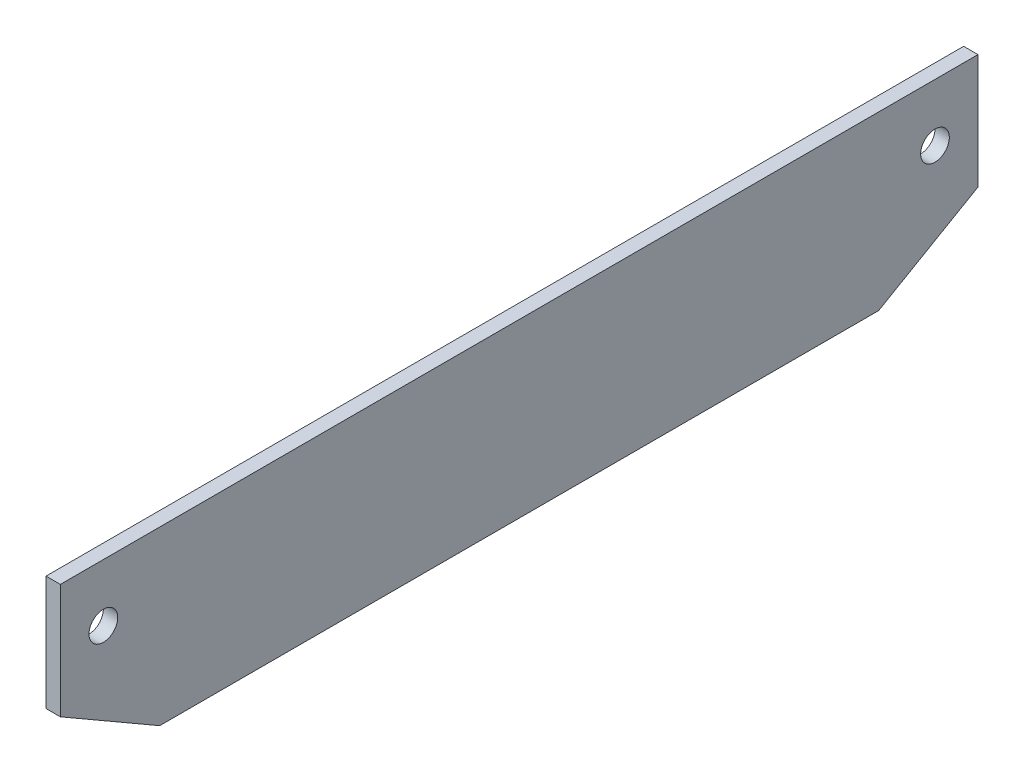
ISO-10303-21;
HEADER;
FILE_DESCRIPTION(('STEP AP214'),'2;1');
FILE_NAME('part.step','',(''),(''),'','','');
FILE_SCHEMA(('AUTOMOTIVE_DESIGN { 1 0 10303 214 1 1 1 1 }'));
ENDSEC;
DATA;
#1=APPLICATION_CONTEXT('core data for automotive mechanical design processes');
#2=APPLICATION_PROTOCOL_DEFINITION('international standard','automotive_design',2000,#1);
#3=PRODUCT_CONTEXT('',#1,'mechanical');
#4=PRODUCT('Part','Part','',(#3));
#5=PRODUCT_RELATED_PRODUCT_CATEGORY('part','',(#4));
#6=PRODUCT_DEFINITION_FORMATION('','',#4);
#7=PRODUCT_DEFINITION_CONTEXT('part definition',#1,'design');
#8=PRODUCT_DEFINITION('design','',#6,#7);
#9=PRODUCT_DEFINITION_SHAPE('','',#8);
#10=(LENGTH_UNIT() NAMED_UNIT(*) SI_UNIT(.MILLI.,.METRE.));
#11=(NAMED_UNIT(*) PLANE_ANGLE_UNIT() SI_UNIT($,.RADIAN.));
#12=(NAMED_UNIT(*) SI_UNIT($,.STERADIAN.) SOLID_ANGLE_UNIT());
#13=UNCERTAINTY_MEASURE_WITH_UNIT(LENGTH_MEASURE(1.E-05),#10,'distance_accuracy_value','');
#14=(GEOMETRIC_REPRESENTATION_CONTEXT(3) GLOBAL_UNCERTAINTY_ASSIGNED_CONTEXT((#13)) GLOBAL_UNIT_ASSIGNED_CONTEXT((#10,
#11,#12)) REPRESENTATION_CONTEXT('',''));
#15=CARTESIAN_POINT('',(0.,0.,0.));
#16=DIRECTION('',(0.,0.,1.));
#17=DIRECTION('',(1.,0.,0.));
#18=AXIS2_PLACEMENT_3D('',#15,#16,#17);
#19=CARTESIAN_POINT('',(3.175,0.,0.));
#20=DIRECTION('',(-1.,0.,0.));
#21=DIRECTION('',(0.,0.,1.));
#22=AXIS2_PLACEMENT_3D('',#19,#20,#21);
#23=PLANE('',#22);
#24=DIRECTION('',(0.,1.,0.));
#25=VECTOR('',#24,1.);
#26=CARTESIAN_POINT('',(3.175,-12.7,-101.6));
#27=LINE('',#26,#25);
#28=CARTESIAN_POINT('',(3.175,-12.7,-101.6));
#29=VERTEX_POINT('',#28);
#30=CARTESIAN_POINT('',(3.175,12.7,-101.6));
#31=VERTEX_POINT('',#30);
#32=EDGE_CURVE('E128',#29,#31,#27,.T.);
#33=ORIENTED_EDGE('',*,*,#32,.T.);
#34=DIRECTION('',(0.,0.,1.));
#35=VECTOR('',#34,1.);
#36=CARTESIAN_POINT('',(3.175,12.7,101.6));
#37=LINE('',#36,#35);
#38=CARTESIAN_POINT('',(3.175,12.7,101.6));
#39=VERTEX_POINT('',#38);
#40=EDGE_CURVE('E86',#31,#39,#37,.T.);
#41=ORIENTED_EDGE('',*,*,#40,.T.);
#42=DIRECTION('',(0.,-1.,0.));
#43=VECTOR('',#42,1.);
#44=CARTESIAN_POINT('',(3.175,-12.7,101.6));
#45=LINE('',#44,#43);
#46=CARTESIAN_POINT('',(3.175,-12.7,101.6));
#47=VERTEX_POINT('',#46);
#48=EDGE_CURVE('E99',#39,#47,#45,.T.);
#49=ORIENTED_EDGE('',*,*,#48,.T.);
#50=DIRECTION('',(0.,-0.499999999999995,-0.866025403784442));
#51=VECTOR('',#50,1.);
#52=CARTESIAN_POINT('',(3.175,-12.7,101.6));
#53=LINE('',#52,#51);
#54=CARTESIAN_POINT('',(3.175,-25.4,79.6029547438749));
#55=VERTEX_POINT('',#54);
#56=EDGE_CURVE('E93',#47,#55,#53,.T.);
#57=ORIENTED_EDGE('',*,*,#56,.T.);
#58=DIRECTION('',(0.,0.,-1.));
#59=VECTOR('',#58,1.);
#60=CARTESIAN_POINT('',(3.175,-25.4,-79.6029547438749));
#61=LINE('',#60,#59);
#62=CARTESIAN_POINT('',(3.175,-25.4,-79.6029547438749));
#63=VERTEX_POINT('',#62);
#64=EDGE_CURVE('E97',#55,#63,#61,.T.);
#65=ORIENTED_EDGE('',*,*,#64,.T.);
#66=DIRECTION('',(0.,0.499999999999994,-0.866025403784442));
#67=VECTOR('',#66,1.);
#68=CARTESIAN_POINT('',(3.175,-12.7,-101.6));
#69=LINE('',#68,#67);
#70=EDGE_CURVE('E49',#63,#29,#69,.T.);
#71=ORIENTED_EDGE('',*,*,#70,.T.);
#72=EDGE_LOOP('',(#33,#41,#49,#57,#65,#71));
#73=FACE_BOUND('',#72,.T.);
#74=CARTESIAN_POINT('',(3.175,0.,92.075));
#75=DIRECTION('',(1.,0.,0.));
#76=DIRECTION('',(0.,0.,-1.));
#77=AXIS2_PLACEMENT_3D('',#74,#75,#76);
#78=CIRCLE('',#77,3.175);
#79=CARTESIAN_POINT('',(3.175,0.,88.9));
#80=VERTEX_POINT('',#79);
#81=EDGE_CURVE('E121',#80,#80,#78,.T.);
#82=ORIENTED_EDGE('',*,*,#81,.F.);
#83=EDGE_LOOP('',(#82));
#84=FACE_BOUND('',#83,.T.);
#85=CARTESIAN_POINT('',(3.175,0.,-92.075));
#86=DIRECTION('',(1.,0.,0.));
#87=DIRECTION('',(0.,0.,-1.));
#88=AXIS2_PLACEMENT_3D('',#85,#86,#87);
#89=CIRCLE('',#88,3.175);
#90=CARTESIAN_POINT('',(3.175,0.,-95.25));
#91=VERTEX_POINT('',#90);
#92=EDGE_CURVE('E169',#91,#91,#89,.T.);
#93=ORIENTED_EDGE('',*,*,#92,.F.);
#94=EDGE_LOOP('',(#93));
#95=FACE_BOUND('',#94,.T.);
#96=ADVANCED_FACE('F32',(#73,#84,#95),#23,.F.);
#97=CARTESIAN_POINT('',(0.,0.,0.));
#98=DIRECTION('',(-1.,0.,0.));
#99=DIRECTION('',(0.,0.,1.));
#100=AXIS2_PLACEMENT_3D('',#97,#98,#99);
#101=PLANE('',#100);
#102=CARTESIAN_POINT('',(0.,0.,92.075));
#103=DIRECTION('',(1.,0.,0.));
#104=DIRECTION('',(0.,0.,-1.));
#105=AXIS2_PLACEMENT_3D('',#102,#103,#104);
#106=CIRCLE('',#105,3.175);
#107=CARTESIAN_POINT('',(0.,0.,88.9));
#108=VERTEX_POINT('',#107);
#109=EDGE_CURVE('E174',#108,#108,#106,.T.);
#110=ORIENTED_EDGE('',*,*,#109,.T.);
#111=EDGE_LOOP('',(#110));
#112=FACE_BOUND('',#111,.T.);
#113=DIRECTION('',(0.,1.,0.));
#114=VECTOR('',#113,1.);
#115=CARTESIAN_POINT('',(0.,-12.7,-101.6));
#116=LINE('',#115,#114);
#117=CARTESIAN_POINT('',(0.,-12.7,-101.6));
#118=VERTEX_POINT('',#117);
#119=CARTESIAN_POINT('',(0.,12.7,-101.6));
#120=VERTEX_POINT('',#119);
#121=EDGE_CURVE('E117',#118,#120,#116,.T.);
#122=ORIENTED_EDGE('',*,*,#121,.F.);
#123=DIRECTION('',(0.,0.499999999999994,-0.866025403784442));
#124=VECTOR('',#123,1.);
#125=CARTESIAN_POINT('',(0.,-12.7,-101.6));
#126=LINE('',#125,#124);
#127=CARTESIAN_POINT('',(0.,-25.4,-79.6029547438749));
#128=VERTEX_POINT('',#127);
#129=EDGE_CURVE('E78',#128,#118,#126,.T.);
#130=ORIENTED_EDGE('',*,*,#129,.F.);
#131=DIRECTION('',(0.,0.,-1.));
#132=VECTOR('',#131,1.);
#133=CARTESIAN_POINT('',(0.,-25.4,-79.6029547438749));
#134=LINE('',#133,#132);
#135=CARTESIAN_POINT('',(0.,-25.4,79.6029547438749));
#136=VERTEX_POINT('',#135);
#137=EDGE_CURVE('E72',#136,#128,#134,.T.);
#138=ORIENTED_EDGE('',*,*,#137,.F.);
#139=DIRECTION('',(0.,-0.499999999999995,-0.866025403784442));
#140=VECTOR('',#139,1.);
#141=CARTESIAN_POINT('',(0.,-12.7,101.6));
#142=LINE('',#141,#140);
#143=CARTESIAN_POINT('',(0.,-12.7,101.6));
#144=VERTEX_POINT('',#143);
#145=EDGE_CURVE('E107',#144,#136,#142,.T.);
#146=ORIENTED_EDGE('',*,*,#145,.F.);
#147=DIRECTION('',(0.,-1.,0.));
#148=VECTOR('',#147,1.);
#149=CARTESIAN_POINT('',(0.,-12.7,101.6));
#150=LINE('',#149,#148);
#151=CARTESIAN_POINT('',(0.,12.7,101.6));
#152=VERTEX_POINT('',#151);
#153=EDGE_CURVE('E123',#152,#144,#150,.T.);
#154=ORIENTED_EDGE('',*,*,#153,.F.);
#155=DIRECTION('',(0.,0.,1.));
#156=VECTOR('',#155,1.);
#157=CARTESIAN_POINT('',(0.,12.7,101.6));
#158=LINE('',#157,#156);
#159=EDGE_CURVE('E120',#120,#152,#158,.T.);
#160=ORIENTED_EDGE('',*,*,#159,.F.);
#161=EDGE_LOOP('',(#122,#130,#138,#146,#154,#160));
#162=FACE_BOUND('',#161,.T.);
#163=CARTESIAN_POINT('',(0.,0.,-92.075));
#164=DIRECTION('',(1.,0.,0.));
#165=DIRECTION('',(0.,0.,-1.));
#166=AXIS2_PLACEMENT_3D('',#163,#164,#165);
#167=CIRCLE('',#166,3.175);
#168=CARTESIAN_POINT('',(0.,0.,-95.25));
#169=VERTEX_POINT('',#168);
#170=EDGE_CURVE('E172',#169,#169,#167,.T.);
#171=ORIENTED_EDGE('',*,*,#170,.T.);
#172=EDGE_LOOP('',(#171));
#173=FACE_BOUND('',#172,.T.);
#174=ADVANCED_FACE('F137',(#112,#162,#173),#101,.T.);
#175=CARTESIAN_POINT('',(3.175,-12.7,-101.6));
#176=DIRECTION('',(0.,0.,1.));
#177=DIRECTION('',(1.,0.,0.));
#178=AXIS2_PLACEMENT_3D('',#175,#176,#177);
#179=PLANE('',#178);
#180=ORIENTED_EDGE('',*,*,#121,.T.);
#181=DIRECTION('',(-1.,0.,0.));
#182=VECTOR('',#181,1.);
#183=CARTESIAN_POINT('',(3.175,12.7,-101.6));
#184=LINE('',#183,#182);
#185=EDGE_CURVE('E11',#31,#120,#184,.T.);
#186=ORIENTED_EDGE('',*,*,#185,.F.);
#187=ORIENTED_EDGE('',*,*,#32,.F.);
#188=DIRECTION('',(-1.,0.,0.));
#189=VECTOR('',#188,1.);
#190=CARTESIAN_POINT('',(3.175,-12.7,-101.6));
#191=LINE('',#190,#189);
#192=EDGE_CURVE('E113',#29,#118,#191,.T.);
#193=ORIENTED_EDGE('',*,*,#192,.T.);
#194=EDGE_LOOP('',(#180,#186,#187,#193));
#195=FACE_BOUND('',#194,.T.);
#196=ADVANCED_FACE('F34',(#195),#179,.F.);
#197=CARTESIAN_POINT('',(3.175,12.7,101.6));
#198=DIRECTION('',(0.,-1.,0.));
#199=DIRECTION('',(0.,0.,-1.));
#200=AXIS2_PLACEMENT_3D('',#197,#198,#199);
#201=PLANE('',#200);
#202=ORIENTED_EDGE('',*,*,#159,.T.);
#203=DIRECTION('',(-1.,0.,0.));
#204=VECTOR('',#203,1.);
#205=CARTESIAN_POINT('',(3.175,12.7,101.6));
#206=LINE('',#205,#204);
#207=EDGE_CURVE('E41',#39,#152,#206,.T.);
#208=ORIENTED_EDGE('',*,*,#207,.F.);
#209=ORIENTED_EDGE('',*,*,#40,.F.);
#210=ORIENTED_EDGE('',*,*,#185,.T.);
#211=EDGE_LOOP('',(#202,#208,#209,#210));
#212=FACE_BOUND('',#211,.T.);
#213=ADVANCED_FACE('F217',(#212),#201,.F.);
#214=CARTESIAN_POINT('',(3.175,-12.7,101.6));
#215=DIRECTION('',(0.,0.,-1.));
#216=DIRECTION('',(-1.,0.,0.));
#217=AXIS2_PLACEMENT_3D('',#214,#215,#216);
#218=PLANE('',#217);
#219=ORIENTED_EDGE('',*,*,#153,.T.);
#220=DIRECTION('',(-1.,0.,0.));
#221=VECTOR('',#220,1.);
#222=CARTESIAN_POINT('',(3.175,-12.7,101.6));
#223=LINE('',#222,#221);
#224=EDGE_CURVE('E108',#47,#144,#223,.T.);
#225=ORIENTED_EDGE('',*,*,#224,.F.);
#226=ORIENTED_EDGE('',*,*,#48,.F.);
#227=ORIENTED_EDGE('',*,*,#207,.T.);
#228=EDGE_LOOP('',(#219,#225,#226,#227));
#229=FACE_BOUND('',#228,.T.);
#230=ADVANCED_FACE('F134',(#229),#218,.F.);
#231=CARTESIAN_POINT('',(3.175,-12.7,101.6));
#232=DIRECTION('',(0.,0.866025403784442,-0.499999999999995));
#233=DIRECTION('',(0.,0.499999999999995,0.866025403784442));
#234=AXIS2_PLACEMENT_3D('',#231,#232,#233);
#235=PLANE('',#234);
#236=ORIENTED_EDGE('',*,*,#145,.T.);
#237=DIRECTION('',(-1.,0.,0.));
#238=VECTOR('',#237,1.);
#239=CARTESIAN_POINT('',(3.175,-25.4,79.6029547438749));
#240=LINE('',#239,#238);
#241=EDGE_CURVE('E104',#55,#136,#240,.T.);
#242=ORIENTED_EDGE('',*,*,#241,.F.);
#243=ORIENTED_EDGE('',*,*,#56,.F.);
#244=ORIENTED_EDGE('',*,*,#224,.T.);
#245=EDGE_LOOP('',(#236,#242,#243,#244));
#246=FACE_BOUND('',#245,.T.);
#247=ADVANCED_FACE('F105',(#246),#235,.F.);
#248=CARTESIAN_POINT('',(3.175,-25.4,-79.6029547438749));
#249=DIRECTION('',(0.,1.,0.));
#250=DIRECTION('',(0.,0.,1.));
#251=AXIS2_PLACEMENT_3D('',#248,#249,#250);
#252=PLANE('',#251);
#253=ORIENTED_EDGE('',*,*,#137,.T.);
#254=DIRECTION('',(-1.,0.,0.));
#255=VECTOR('',#254,1.);
#256=CARTESIAN_POINT('',(3.175,-25.4,-79.6029547438749));
#257=LINE('',#256,#255);
#258=EDGE_CURVE('E109',#63,#128,#257,.T.);
#259=ORIENTED_EDGE('',*,*,#258,.F.);
#260=ORIENTED_EDGE('',*,*,#64,.F.);
#261=ORIENTED_EDGE('',*,*,#241,.T.);
#262=EDGE_LOOP('',(#253,#259,#260,#261));
#263=FACE_BOUND('',#262,.T.);
#264=ADVANCED_FACE('F111',(#263),#252,.F.);
#265=CARTESIAN_POINT('',(3.175,-12.7,-101.6));
#266=DIRECTION('',(0.,0.866025403784442,0.499999999999994));
#267=DIRECTION('',(0.,-0.499999999999994,0.866025403784442));
#268=AXIS2_PLACEMENT_3D('',#265,#266,#267);
#269=PLANE('',#268);
#270=ORIENTED_EDGE('',*,*,#129,.T.);
#271=ORIENTED_EDGE('',*,*,#192,.F.);
#272=ORIENTED_EDGE('',*,*,#70,.F.);
#273=ORIENTED_EDGE('',*,*,#258,.T.);
#274=EDGE_LOOP('',(#270,#271,#272,#273));
#275=FACE_BOUND('',#274,.T.);
#276=ADVANCED_FACE('F142',(#275),#269,.F.);
#277=CARTESIAN_POINT('',(3.175,0.,92.075));
#278=DIRECTION('',(-1.,0.,0.));
#279=DIRECTION('',(0.,0.,1.));
#280=AXIS2_PLACEMENT_3D('',#277,#278,#279);
#281=CYLINDRICAL_SURFACE('',#280,3.175);
#282=ORIENTED_EDGE('',*,*,#81,.T.);
#283=EDGE_LOOP('',(#282));
#284=FACE_BOUND('',#283,.T.);
#285=ORIENTED_EDGE('',*,*,#109,.F.);
#286=EDGE_LOOP('',(#285));
#287=FACE_BOUND('',#286,.T.);
#288=ADVANCED_FACE('F144',(#284,#287),#281,.F.);
#289=CARTESIAN_POINT('',(3.175,0.,-92.075));
#290=DIRECTION('',(-1.,0.,0.));
#291=DIRECTION('',(0.,0.,1.));
#292=AXIS2_PLACEMENT_3D('',#289,#290,#291);
#293=CYLINDRICAL_SURFACE('',#292,3.175);
#294=ORIENTED_EDGE('',*,*,#92,.T.);
#295=EDGE_LOOP('',(#294));
#296=FACE_BOUND('',#295,.T.);
#297=ORIENTED_EDGE('',*,*,#170,.F.);
#298=EDGE_LOOP('',(#297));
#299=FACE_BOUND('',#298,.T.);
#300=ADVANCED_FACE('F150',(#296,#299),#293,.F.);
#301=CLOSED_SHELL('',(#96,#174,#196,#213,#230,#247,#264,#276,#288,#300));
#302=MANIFOLD_SOLID_BREP('B2',#301);
#303=ADVANCED_BREP_SHAPE_REPRESENTATION('',(#18,#302),#14);
#304=SHAPE_DEFINITION_REPRESENTATION(#9,#303);
ENDSEC;
END-ISO-10303-21;
